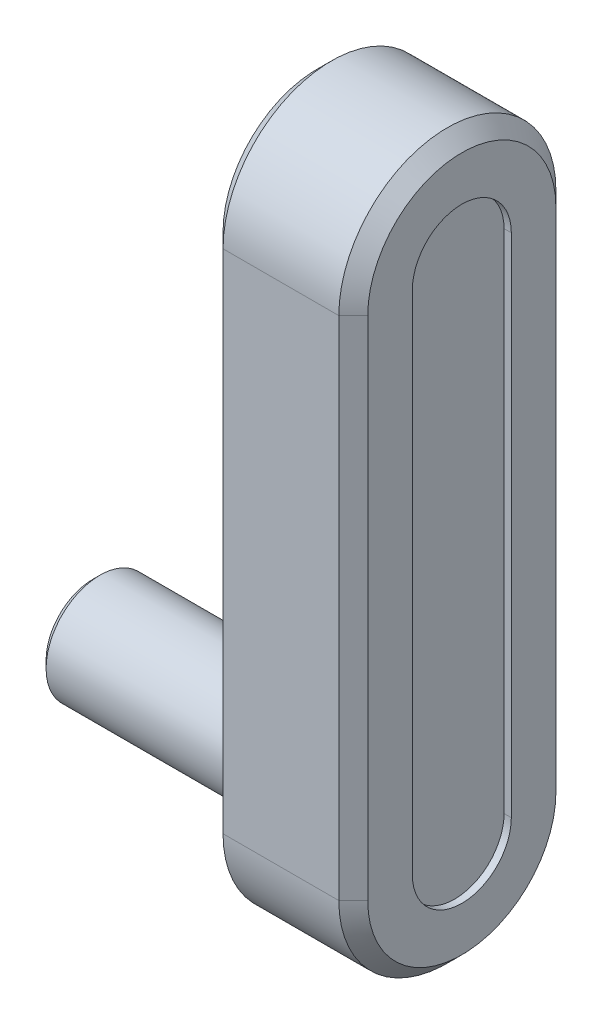
ISO-10303-21;
HEADER;
FILE_DESCRIPTION(('STEP AP214'),'2;1');
FILE_NAME('part.step','',(''),(''),'','','');
FILE_SCHEMA(('AUTOMOTIVE_DESIGN { 1 0 10303 214 1 1 1 1 }'));
ENDSEC;
DATA;
#1=APPLICATION_CONTEXT('core data for automotive mechanical design processes');
#2=APPLICATION_PROTOCOL_DEFINITION('international standard','automotive_design',2000,#1);
#3=PRODUCT_CONTEXT('',#1,'mechanical');
#4=PRODUCT('Part','Part','',(#3));
#5=PRODUCT_RELATED_PRODUCT_CATEGORY('part','',(#4));
#6=PRODUCT_DEFINITION_FORMATION('','',#4);
#7=PRODUCT_DEFINITION_CONTEXT('part definition',#1,'design');
#8=PRODUCT_DEFINITION('design','',#6,#7);
#9=PRODUCT_DEFINITION_SHAPE('','',#8);
#10=(LENGTH_UNIT() NAMED_UNIT(*) SI_UNIT(.MILLI.,.METRE.));
#11=(NAMED_UNIT(*) PLANE_ANGLE_UNIT() SI_UNIT($,.RADIAN.));
#12=(NAMED_UNIT(*) SI_UNIT($,.STERADIAN.) SOLID_ANGLE_UNIT());
#13=UNCERTAINTY_MEASURE_WITH_UNIT(LENGTH_MEASURE(1.E-05),#10,'distance_accuracy_value','');
#14=(GEOMETRIC_REPRESENTATION_CONTEXT(3) GLOBAL_UNCERTAINTY_ASSIGNED_CONTEXT((#13)) GLOBAL_UNIT_ASSIGNED_CONTEXT((#10,
#11,#12)) REPRESENTATION_CONTEXT('',''));
#15=CARTESIAN_POINT('',(0.,0.,0.));
#16=DIRECTION('',(0.,0.,1.));
#17=DIRECTION('',(1.,0.,0.));
#18=AXIS2_PLACEMENT_3D('',#15,#16,#17);
#19=CARTESIAN_POINT('',(30.,0.,15.));
#20=DIRECTION('',(0.,0.,-1.));
#21=DIRECTION('',(0.,1.,0.));
#22=AXIS2_PLACEMENT_3D('',#19,#20,#21);
#23=PLANE('',#22);
#24=DIRECTION('',(-1.,0.,0.));
#25=VECTOR('',#24,1.);
#26=CARTESIAN_POINT('',(30.,0.,15.));
#27=LINE('',#26,#25);
#28=CARTESIAN_POINT('',(28.,0.,15.));
#29=VERTEX_POINT('',#28);
#30=CARTESIAN_POINT('',(12.,0.,15.));
#31=VERTEX_POINT('',#30);
#32=EDGE_CURVE('E189',#29,#31,#27,.T.);
#33=ORIENTED_EDGE('',*,*,#32,.T.);
#34=DIRECTION('',(0.,-1.,0.));
#35=VECTOR('',#34,1.);
#36=CARTESIAN_POINT('',(12.,0.,15.));
#37=LINE('',#36,#35);
#38=CARTESIAN_POINT('',(12.,-70.,15.));
#39=VERTEX_POINT('',#38);
#40=EDGE_CURVE('E242',#31,#39,#37,.T.);
#41=ORIENTED_EDGE('',*,*,#40,.T.);
#42=DIRECTION('',(-1.,0.,0.));
#43=VECTOR('',#42,1.);
#44=CARTESIAN_POINT('',(30.,-70.,15.));
#45=LINE('',#44,#43);
#46=CARTESIAN_POINT('',(28.,-70.,15.));
#47=VERTEX_POINT('',#46);
#48=EDGE_CURVE('E202',#47,#39,#45,.T.);
#49=ORIENTED_EDGE('',*,*,#48,.F.);
#50=DIRECTION('',(0.,1.,0.));
#51=VECTOR('',#50,1.);
#52=CARTESIAN_POINT('',(28.,0.,15.));
#53=LINE('',#52,#51);
#54=EDGE_CURVE('E239',#47,#29,#53,.T.);
#55=ORIENTED_EDGE('',*,*,#54,.T.);
#56=EDGE_LOOP('',(#33,#41,#49,#55));
#57=FACE_BOUND('',#56,.T.);
#58=ADVANCED_FACE('F43',(#57),#23,.F.);
#59=CARTESIAN_POINT('',(30.,-70.,0.));
#60=DIRECTION('',(-1.,0.,0.));
#61=DIRECTION('',(0.,0.,1.));
#62=AXIS2_PLACEMENT_3D('',#59,#60,#61);
#63=CYLINDRICAL_SURFACE('',#62,15.);
#64=ORIENTED_EDGE('',*,*,#48,.T.);
#65=CARTESIAN_POINT('',(12.,-70.,0.));
#66=DIRECTION('',(1.,0.,0.));
#67=DIRECTION('',(0.,0.,-1.));
#68=AXIS2_PLACEMENT_3D('',#65,#66,#67);
#69=CIRCLE('',#68,15.);
#70=CARTESIAN_POINT('',(12.,-70.,-15.));
#71=VERTEX_POINT('',#70);
#72=EDGE_CURVE('E236',#39,#71,#69,.T.);
#73=ORIENTED_EDGE('',*,*,#72,.T.);
#74=DIRECTION('',(-1.,0.,0.));
#75=VECTOR('',#74,1.);
#76=CARTESIAN_POINT('',(30.,-70.,-15.));
#77=LINE('',#76,#75);
#78=CARTESIAN_POINT('',(28.,-70.,-15.));
#79=VERTEX_POINT('',#78);
#80=EDGE_CURVE('E198',#79,#71,#77,.T.);
#81=ORIENTED_EDGE('',*,*,#80,.F.);
#82=CARTESIAN_POINT('',(28.,-70.,0.));
#83=DIRECTION('',(1.,0.,0.));
#84=DIRECTION('',(0.,0.,-1.));
#85=AXIS2_PLACEMENT_3D('',#82,#83,#84);
#86=CIRCLE('',#85,15.);
#87=EDGE_CURVE('E233',#79,#47,#86,.F.);
#88=ORIENTED_EDGE('',*,*,#87,.T.);
#89=EDGE_LOOP('',(#64,#73,#81,#88));
#90=FACE_BOUND('',#89,.T.);
#91=ADVANCED_FACE('F318',(#90),#63,.T.);
#92=CARTESIAN_POINT('',(30.,0.,-15.));
#93=DIRECTION('',(0.,0.,-1.));
#94=DIRECTION('',(0.,1.,0.));
#95=AXIS2_PLACEMENT_3D('',#92,#93,#94);
#96=PLANE('',#95);
#97=ORIENTED_EDGE('',*,*,#80,.T.);
#98=DIRECTION('',(0.,1.,0.));
#99=VECTOR('',#98,1.);
#100=CARTESIAN_POINT('',(12.,0.,-15.));
#101=LINE('',#100,#99);
#102=CARTESIAN_POINT('',(12.,0.,-15.));
#103=VERTEX_POINT('',#102);
#104=EDGE_CURVE('E223',#71,#103,#101,.T.);
#105=ORIENTED_EDGE('',*,*,#104,.T.);
#106=DIRECTION('',(-1.,0.,0.));
#107=VECTOR('',#106,1.);
#108=CARTESIAN_POINT('',(30.,0.,-15.));
#109=LINE('',#108,#107);
#110=CARTESIAN_POINT('',(28.,0.,-15.));
#111=VERTEX_POINT('',#110);
#112=EDGE_CURVE('E193',#111,#103,#109,.T.);
#113=ORIENTED_EDGE('',*,*,#112,.F.);
#114=DIRECTION('',(0.,-1.,0.));
#115=VECTOR('',#114,1.);
#116=CARTESIAN_POINT('',(28.,0.,-15.));
#117=LINE('',#116,#115);
#118=EDGE_CURVE('E219',#111,#79,#117,.T.);
#119=ORIENTED_EDGE('',*,*,#118,.T.);
#120=EDGE_LOOP('',(#97,#105,#113,#119));
#121=FACE_BOUND('',#120,.T.);
#122=ADVANCED_FACE('F324',(#121),#96,.T.);
#123=CARTESIAN_POINT('',(30.,0.,0.));
#124=DIRECTION('',(-1.,0.,0.));
#125=DIRECTION('',(0.,0.,1.));
#126=AXIS2_PLACEMENT_3D('',#123,#124,#125);
#127=CYLINDRICAL_SURFACE('',#126,15.);
#128=ORIENTED_EDGE('',*,*,#112,.T.);
#129=CARTESIAN_POINT('',(12.,0.,0.));
#130=DIRECTION('',(1.,0.,0.));
#131=DIRECTION('',(0.,0.,-1.));
#132=AXIS2_PLACEMENT_3D('',#129,#130,#131);
#133=CIRCLE('',#132,15.);
#134=EDGE_CURVE('E230',#103,#31,#133,.T.);
#135=ORIENTED_EDGE('',*,*,#134,.T.);
#136=ORIENTED_EDGE('',*,*,#32,.F.);
#137=CARTESIAN_POINT('',(28.,0.,0.));
#138=DIRECTION('',(1.,0.,0.));
#139=DIRECTION('',(0.,0.,-1.));
#140=AXIS2_PLACEMENT_3D('',#137,#138,#139);
#141=CIRCLE('',#140,15.);
#142=EDGE_CURVE('E227',#29,#111,#141,.F.);
#143=ORIENTED_EDGE('',*,*,#142,.T.);
#144=EDGE_LOOP('',(#128,#135,#136,#143));
#145=FACE_BOUND('',#144,.T.);
#146=ADVANCED_FACE('F441',(#145),#127,.T.);
#147=CARTESIAN_POINT('',(30.,0.,0.));
#148=DIRECTION('',(1.,0.,0.));
#149=DIRECTION('',(0.,0.,-1.));
#150=AXIS2_PLACEMENT_3D('',#147,#148,#149);
#151=PLANE('',#150);
#152=CARTESIAN_POINT('',(30.,0.,0.));
#153=DIRECTION('',(1.,0.,0.));
#154=DIRECTION('',(0.,0.,-1.));
#155=AXIS2_PLACEMENT_3D('',#152,#153,#154);
#156=CIRCLE('',#155,6.83563427501715);
#157=CARTESIAN_POINT('',(30.,0.,-6.83563427501715));
#158=VERTEX_POINT('',#157);
#159=CARTESIAN_POINT('',(30.,0.,6.83563427501715));
#160=VERTEX_POINT('',#159);
#161=EDGE_CURVE('E60',#158,#160,#156,.T.);
#162=ORIENTED_EDGE('',*,*,#161,.F.);
#163=DIRECTION('',(0.,1.,0.));
#164=VECTOR('',#163,1.);
#165=CARTESIAN_POINT('',(30.,0.,-6.83563427501715));
#166=LINE('',#165,#164);
#167=CARTESIAN_POINT('',(30.,-70.,-6.83563427501715));
#168=VERTEX_POINT('',#167);
#169=EDGE_CURVE('E159',#168,#158,#166,.T.);
#170=ORIENTED_EDGE('',*,*,#169,.F.);
#171=CARTESIAN_POINT('',(30.,-70.,0.));
#172=DIRECTION('',(1.,0.,0.));
#173=DIRECTION('',(0.,0.,-1.));
#174=AXIS2_PLACEMENT_3D('',#171,#172,#173);
#175=CIRCLE('',#174,6.83563427501715);
#176=CARTESIAN_POINT('',(30.,-70.,6.83563427501714));
#177=VERTEX_POINT('',#176);
#178=EDGE_CURVE('E163',#177,#168,#175,.T.);
#179=ORIENTED_EDGE('',*,*,#178,.F.);
#180=DIRECTION('',(0.,-1.,0.));
#181=VECTOR('',#180,1.);
#182=CARTESIAN_POINT('',(30.,0.,6.83563427501715));
#183=LINE('',#182,#181);
#184=EDGE_CURVE('E174',#160,#177,#183,.T.);
#185=ORIENTED_EDGE('',*,*,#184,.F.);
#186=EDGE_LOOP('',(#162,#170,#179,#185));
#187=FACE_BOUND('',#186,.T.);
#188=CARTESIAN_POINT('',(30.,-70.,0.));
#189=DIRECTION('',(1.,0.,0.));
#190=DIRECTION('',(0.,0.,-1.));
#191=AXIS2_PLACEMENT_3D('',#188,#189,#190);
#192=CIRCLE('',#191,13.);
#193=CARTESIAN_POINT('',(30.,-70.,13.));
#194=VERTEX_POINT('',#193);
#195=CARTESIAN_POINT('',(30.,-70.,-13.));
#196=VERTEX_POINT('',#195);
#197=EDGE_CURVE('E248',#194,#196,#192,.T.);
#198=ORIENTED_EDGE('',*,*,#197,.T.);
#199=DIRECTION('',(0.,1.,0.));
#200=VECTOR('',#199,1.);
#201=CARTESIAN_POINT('',(30.,0.,-13.));
#202=LINE('',#201,#200);
#203=CARTESIAN_POINT('',(30.,0.,-13.));
#204=VERTEX_POINT('',#203);
#205=EDGE_CURVE('E254',#196,#204,#202,.T.);
#206=ORIENTED_EDGE('',*,*,#205,.T.);
#207=CARTESIAN_POINT('',(30.,0.,0.));
#208=DIRECTION('',(1.,0.,0.));
#209=DIRECTION('',(0.,0.,-1.));
#210=AXIS2_PLACEMENT_3D('',#207,#208,#209);
#211=CIRCLE('',#210,13.);
#212=CARTESIAN_POINT('',(30.,0.,13.));
#213=VERTEX_POINT('',#212);
#214=EDGE_CURVE('E251',#204,#213,#211,.T.);
#215=ORIENTED_EDGE('',*,*,#214,.T.);
#216=DIRECTION('',(0.,-1.,0.));
#217=VECTOR('',#216,1.);
#218=CARTESIAN_POINT('',(30.,-70.,13.));
#219=LINE('',#218,#217);
#220=EDGE_CURVE('E245',#213,#194,#219,.T.);
#221=ORIENTED_EDGE('',*,*,#220,.T.);
#222=EDGE_LOOP('',(#198,#206,#215,#221));
#223=FACE_BOUND('',#222,.T.);
#224=ADVANCED_FACE('F438',(#187,#223),#151,.T.);
#225=CARTESIAN_POINT('',(10.,0.,0.));
#226=DIRECTION('',(1.,0.,0.));
#227=DIRECTION('',(0.,0.,-1.));
#228=AXIS2_PLACEMENT_3D('',#225,#226,#227);
#229=PLANE('',#228);
#230=CARTESIAN_POINT('',(10.,0.,0.));
#231=DIRECTION('',(1.,0.,0.));
#232=DIRECTION('',(0.,0.,-1.));
#233=AXIS2_PLACEMENT_3D('',#230,#231,#232);
#234=CIRCLE('',#233,5.89999999999997);
#235=CARTESIAN_POINT('',(10.,0.,-5.89999999999997));
#236=VERTEX_POINT('',#235);
#237=EDGE_CURVE('E295',#236,#236,#234,.T.);
#238=ORIENTED_EDGE('',*,*,#237,.T.);
#239=EDGE_LOOP('',(#238));
#240=FACE_BOUND('',#239,.T.);
#241=CARTESIAN_POINT('',(10.,-70.,0.));
#242=DIRECTION('',(1.,0.,0.));
#243=DIRECTION('',(0.,0.,-1.));
#244=AXIS2_PLACEMENT_3D('',#241,#242,#243);
#245=CIRCLE('',#244,10.);
#246=CARTESIAN_POINT('',(10.,-70.,-10.));
#247=VERTEX_POINT('',#246);
#248=EDGE_CURVE('E258',#247,#247,#245,.F.);
#249=ORIENTED_EDGE('',*,*,#248,.F.);
#250=EDGE_LOOP('',(#249));
#251=FACE_BOUND('',#250,.T.);
#252=CARTESIAN_POINT('',(10.,0.,0.));
#253=DIRECTION('',(1.,0.,0.));
#254=DIRECTION('',(0.,0.,-1.));
#255=AXIS2_PLACEMENT_3D('',#252,#253,#254);
#256=CIRCLE('',#255,13.);
#257=CARTESIAN_POINT('',(10.,0.,13.));
#258=VERTEX_POINT('',#257);
#259=CARTESIAN_POINT('',(10.,0.,-13.));
#260=VERTEX_POINT('',#259);
#261=EDGE_CURVE('E212',#258,#260,#256,.F.);
#262=ORIENTED_EDGE('',*,*,#261,.T.);
#263=DIRECTION('',(0.,-1.,0.));
#264=VECTOR('',#263,1.);
#265=CARTESIAN_POINT('',(10.,-70.,-13.));
#266=LINE('',#265,#264);
#267=CARTESIAN_POINT('',(10.,-70.,-13.));
#268=VERTEX_POINT('',#267);
#269=EDGE_CURVE('E215',#260,#268,#266,.T.);
#270=ORIENTED_EDGE('',*,*,#269,.T.);
#271=CARTESIAN_POINT('',(10.,-70.,0.));
#272=DIRECTION('',(1.,0.,0.));
#273=DIRECTION('',(0.,0.,-1.));
#274=AXIS2_PLACEMENT_3D('',#271,#272,#273);
#275=CIRCLE('',#274,13.);
#276=CARTESIAN_POINT('',(10.,-70.,13.));
#277=VERTEX_POINT('',#276);
#278=EDGE_CURVE('E209',#268,#277,#275,.F.);
#279=ORIENTED_EDGE('',*,*,#278,.T.);
#280=DIRECTION('',(0.,1.,0.));
#281=VECTOR('',#280,1.);
#282=CARTESIAN_POINT('',(10.,0.,13.));
#283=LINE('',#282,#281);
#284=EDGE_CURVE('E206',#277,#258,#283,.T.);
#285=ORIENTED_EDGE('',*,*,#284,.T.);
#286=EDGE_LOOP('',(#262,#270,#279,#285));
#287=FACE_BOUND('',#286,.T.);
#288=ADVANCED_FACE('F358',(#240,#251,#287),#229,.F.);
#289=CARTESIAN_POINT('',(12.,0.,15.));
#290=DIRECTION('',(0.70710678118655,0.,-0.707106781186545));
#291=DIRECTION('',(0.,-1.,0.));
#292=AXIS2_PLACEMENT_3D('',#289,#290,#291);
#293=PLANE('',#292);
#294=DIRECTION('',(-0.707106781186545,0.,-0.70710678118655));
#295=VECTOR('',#294,1.);
#296=CARTESIAN_POINT('',(12.,-70.,15.));
#297=LINE('',#296,#295);
#298=EDGE_CURVE('E266',#39,#277,#297,.T.);
#299=ORIENTED_EDGE('',*,*,#298,.F.);
#300=ORIENTED_EDGE('',*,*,#40,.F.);
#301=DIRECTION('',(0.707106781186545,0.,0.70710678118655));
#302=VECTOR('',#301,1.);
#303=CARTESIAN_POINT('',(10.,0.,13.));
#304=LINE('',#303,#302);
#305=EDGE_CURVE('E194',#258,#31,#304,.T.);
#306=ORIENTED_EDGE('',*,*,#305,.F.);
#307=ORIENTED_EDGE('',*,*,#284,.F.);
#308=EDGE_LOOP('',(#299,#300,#306,#307));
#309=FACE_BOUND('',#308,.T.);
#310=ADVANCED_FACE('F352',(#309),#293,.F.);
#311=CARTESIAN_POINT('',(12.,0.,0.));
#312=DIRECTION('',(1.,0.,0.));
#313=DIRECTION('',(0.,0.,-1.));
#314=AXIS2_PLACEMENT_3D('',#311,#312,#313);
#315=CONICAL_SURFACE('',#314,15.,0.785398163397452);
#316=ORIENTED_EDGE('',*,*,#305,.T.);
#317=ORIENTED_EDGE('',*,*,#134,.F.);
#318=DIRECTION('',(0.707106781186545,0.,-0.70710678118655));
#319=VECTOR('',#318,1.);
#320=CARTESIAN_POINT('',(10.,0.,-13.));
#321=LINE('',#320,#319);
#322=EDGE_CURVE('E262',#260,#103,#321,.T.);
#323=ORIENTED_EDGE('',*,*,#322,.F.);
#324=ORIENTED_EDGE('',*,*,#261,.F.);
#325=EDGE_LOOP('',(#316,#317,#323,#324));
#326=FACE_BOUND('',#325,.T.);
#327=ADVANCED_FACE('F345',(#326),#315,.T.);
#328=CARTESIAN_POINT('',(12.,-70.,0.));
#329=DIRECTION('',(1.,0.,0.));
#330=DIRECTION('',(0.,0.,-1.));
#331=AXIS2_PLACEMENT_3D('',#328,#329,#330);
#332=CONICAL_SURFACE('',#331,15.,0.785398163397452);
#333=ORIENTED_EDGE('',*,*,#298,.T.);
#334=ORIENTED_EDGE('',*,*,#278,.F.);
#335=DIRECTION('',(-0.707106781186545,0.,0.70710678118655));
#336=VECTOR('',#335,1.);
#337=CARTESIAN_POINT('',(12.,-70.,-15.));
#338=LINE('',#337,#336);
#339=EDGE_CURVE('E259',#71,#268,#338,.T.);
#340=ORIENTED_EDGE('',*,*,#339,.F.);
#341=ORIENTED_EDGE('',*,*,#72,.F.);
#342=EDGE_LOOP('',(#333,#334,#340,#341));
#343=FACE_BOUND('',#342,.T.);
#344=ADVANCED_FACE('F338',(#343),#332,.T.);
#345=CARTESIAN_POINT('',(10.,0.,-13.));
#346=DIRECTION('',(-0.70710678118655,0.,-0.707106781186545));
#347=DIRECTION('',(0.,1.,0.));
#348=AXIS2_PLACEMENT_3D('',#345,#346,#347);
#349=PLANE('',#348);
#350=ORIENTED_EDGE('',*,*,#322,.T.);
#351=ORIENTED_EDGE('',*,*,#104,.F.);
#352=ORIENTED_EDGE('',*,*,#339,.T.);
#353=ORIENTED_EDGE('',*,*,#269,.F.);
#354=EDGE_LOOP('',(#350,#351,#352,#353));
#355=FACE_BOUND('',#354,.T.);
#356=ADVANCED_FACE('F330',(#355),#349,.T.);
#357=CARTESIAN_POINT('',(30.,0.,13.));
#358=DIRECTION('',(0.707106781186545,0.,0.70710678118655));
#359=DIRECTION('',(0.,1.,0.));
#360=AXIS2_PLACEMENT_3D('',#357,#358,#359);
#361=PLANE('',#360);
#362=DIRECTION('',(-0.70710678118655,0.,0.707106781186545));
#363=VECTOR('',#362,1.);
#364=CARTESIAN_POINT('',(30.,-70.,13.));
#365=LINE('',#364,#363);
#366=EDGE_CURVE('E277',#194,#47,#365,.T.);
#367=ORIENTED_EDGE('',*,*,#366,.F.);
#368=ORIENTED_EDGE('',*,*,#220,.F.);
#369=DIRECTION('',(0.70710678118655,0.,-0.707106781186545));
#370=VECTOR('',#369,1.);
#371=CARTESIAN_POINT('',(28.,0.,15.));
#372=LINE('',#371,#370);
#373=EDGE_CURVE('E263',#29,#213,#372,.T.);
#374=ORIENTED_EDGE('',*,*,#373,.F.);
#375=ORIENTED_EDGE('',*,*,#54,.F.);
#376=EDGE_LOOP('',(#367,#368,#374,#375));
#377=FACE_BOUND('',#376,.T.);
#378=ADVANCED_FACE('F337',(#377),#361,.T.);
#379=CARTESIAN_POINT('',(30.,0.,0.));
#380=DIRECTION('',(-1.,0.,0.));
#381=DIRECTION('',(0.,0.,1.));
#382=AXIS2_PLACEMENT_3D('',#379,#380,#381);
#383=CONICAL_SURFACE('',#382,13.,0.785398163397445);
#384=ORIENTED_EDGE('',*,*,#373,.T.);
#385=ORIENTED_EDGE('',*,*,#214,.F.);
#386=DIRECTION('',(0.70710678118655,0.,0.707106781186545));
#387=VECTOR('',#386,1.);
#388=CARTESIAN_POINT('',(28.,0.,-15.));
#389=LINE('',#388,#387);
#390=EDGE_CURVE('E68',#111,#204,#389,.T.);
#391=ORIENTED_EDGE('',*,*,#390,.F.);
#392=ORIENTED_EDGE('',*,*,#142,.F.);
#393=EDGE_LOOP('',(#384,#385,#391,#392));
#394=FACE_BOUND('',#393,.T.);
#395=ADVANCED_FACE('F374',(#394),#383,.T.);
#396=CARTESIAN_POINT('',(30.,-70.,0.));
#397=DIRECTION('',(-1.,0.,0.));
#398=DIRECTION('',(0.,0.,1.));
#399=AXIS2_PLACEMENT_3D('',#396,#397,#398);
#400=CONICAL_SURFACE('',#399,13.,0.785398163397445);
#401=ORIENTED_EDGE('',*,*,#366,.T.);
#402=ORIENTED_EDGE('',*,*,#87,.F.);
#403=DIRECTION('',(-0.70710678118655,0.,-0.707106781186545));
#404=VECTOR('',#403,1.);
#405=CARTESIAN_POINT('',(30.,-70.,-13.));
#406=LINE('',#405,#404);
#407=EDGE_CURVE('E183',#196,#79,#406,.T.);
#408=ORIENTED_EDGE('',*,*,#407,.F.);
#409=ORIENTED_EDGE('',*,*,#197,.F.);
#410=EDGE_LOOP('',(#401,#402,#408,#409));
#411=FACE_BOUND('',#410,.T.);
#412=ADVANCED_FACE('F368',(#411),#400,.T.);
#413=CARTESIAN_POINT('',(28.,0.,-15.));
#414=DIRECTION('',(-0.707106781186545,0.,0.70710678118655));
#415=DIRECTION('',(0.,-1.,0.));
#416=AXIS2_PLACEMENT_3D('',#413,#414,#415);
#417=PLANE('',#416);
#418=ORIENTED_EDGE('',*,*,#390,.T.);
#419=ORIENTED_EDGE('',*,*,#205,.F.);
#420=ORIENTED_EDGE('',*,*,#407,.T.);
#421=ORIENTED_EDGE('',*,*,#118,.F.);
#422=EDGE_LOOP('',(#418,#419,#420,#421));
#423=FACE_BOUND('',#422,.T.);
#424=ADVANCED_FACE('F361',(#423),#417,.F.);
#425=CARTESIAN_POINT('',(29.,0.,0.));
#426=DIRECTION('',(1.,0.,0.));
#427=DIRECTION('',(0.,0.,-1.));
#428=AXIS2_PLACEMENT_3D('',#425,#426,#427);
#429=CYLINDRICAL_SURFACE('',#428,6.83563427501715);
#430=ORIENTED_EDGE('',*,*,#161,.T.);
#431=DIRECTION('',(1.,0.,0.));
#432=VECTOR('',#431,1.);
#433=CARTESIAN_POINT('',(29.,0.,6.83563427501715));
#434=LINE('',#433,#432);
#435=CARTESIAN_POINT('',(29.,0.,6.83563427501715));
#436=VERTEX_POINT('',#435);
#437=EDGE_CURVE('E134',#436,#160,#434,.T.);
#438=ORIENTED_EDGE('',*,*,#437,.F.);
#439=CARTESIAN_POINT('',(29.,0.,0.));
#440=DIRECTION('',(1.,0.,0.));
#441=DIRECTION('',(0.,0.,-1.));
#442=AXIS2_PLACEMENT_3D('',#439,#440,#441);
#443=CIRCLE('',#442,6.83563427501715);
#444=CARTESIAN_POINT('',(29.,0.,-6.83563427501715));
#445=VERTEX_POINT('',#444);
#446=EDGE_CURVE('E138',#445,#436,#443,.T.);
#447=ORIENTED_EDGE('',*,*,#446,.F.);
#448=DIRECTION('',(1.,0.,0.));
#449=VECTOR('',#448,1.);
#450=CARTESIAN_POINT('',(29.,0.,-6.83563427501715));
#451=LINE('',#450,#449);
#452=EDGE_CURVE('E180',#445,#158,#451,.T.);
#453=ORIENTED_EDGE('',*,*,#452,.T.);
#454=EDGE_LOOP('',(#430,#438,#447,#453));
#455=FACE_BOUND('',#454,.T.);
#456=ADVANCED_FACE('F136',(#455),#429,.F.);
#457=CARTESIAN_POINT('',(29.,0.,-6.83563427501715));
#458=DIRECTION('',(0.,0.,-1.));
#459=DIRECTION('',(0.,1.,0.));
#460=AXIS2_PLACEMENT_3D('',#457,#458,#459);
#461=PLANE('',#460);
#462=ORIENTED_EDGE('',*,*,#169,.T.);
#463=ORIENTED_EDGE('',*,*,#452,.F.);
#464=DIRECTION('',(0.,1.,0.));
#465=VECTOR('',#464,1.);
#466=CARTESIAN_POINT('',(29.,0.,-6.83563427501715));
#467=LINE('',#466,#465);
#468=CARTESIAN_POINT('',(29.,-70.,-6.83563427501715));
#469=VERTEX_POINT('',#468);
#470=EDGE_CURVE('E145',#469,#445,#467,.T.);
#471=ORIENTED_EDGE('',*,*,#470,.F.);
#472=DIRECTION('',(1.,0.,0.));
#473=VECTOR('',#472,1.);
#474=CARTESIAN_POINT('',(29.,-70.,-6.83563427501715));
#475=LINE('',#474,#473);
#476=EDGE_CURVE('E184',#469,#168,#475,.T.);
#477=ORIENTED_EDGE('',*,*,#476,.T.);
#478=EDGE_LOOP('',(#462,#463,#471,#477));
#479=FACE_BOUND('',#478,.T.);
#480=ADVANCED_FACE('F426',(#479),#461,.F.);
#481=CARTESIAN_POINT('',(29.,-70.,0.));
#482=DIRECTION('',(1.,0.,0.));
#483=DIRECTION('',(0.,0.,-1.));
#484=AXIS2_PLACEMENT_3D('',#481,#482,#483);
#485=CYLINDRICAL_SURFACE('',#484,6.83563427501715);
#486=ORIENTED_EDGE('',*,*,#178,.T.);
#487=ORIENTED_EDGE('',*,*,#476,.F.);
#488=CARTESIAN_POINT('',(29.,-70.,0.));
#489=DIRECTION('',(1.,0.,0.));
#490=DIRECTION('',(0.,0.,-1.));
#491=AXIS2_PLACEMENT_3D('',#488,#489,#490);
#492=CIRCLE('',#491,6.83563427501715);
#493=CARTESIAN_POINT('',(29.,-70.,6.83563427501714));
#494=VERTEX_POINT('',#493);
#495=EDGE_CURVE('E154',#494,#469,#492,.T.);
#496=ORIENTED_EDGE('',*,*,#495,.F.);
#497=DIRECTION('',(1.,0.,0.));
#498=VECTOR('',#497,1.);
#499=CARTESIAN_POINT('',(29.,-70.,6.83563427501714));
#500=LINE('',#499,#498);
#501=EDGE_CURVE('E144',#494,#177,#500,.T.);
#502=ORIENTED_EDGE('',*,*,#501,.T.);
#503=EDGE_LOOP('',(#486,#487,#496,#502));
#504=FACE_BOUND('',#503,.T.);
#505=ADVANCED_FACE('F429',(#504),#485,.F.);
#506=CARTESIAN_POINT('',(29.,0.,6.83563427501715));
#507=DIRECTION('',(0.,0.,1.));
#508=DIRECTION('',(0.,-1.,0.));
#509=AXIS2_PLACEMENT_3D('',#506,#507,#508);
#510=PLANE('',#509);
#511=ORIENTED_EDGE('',*,*,#184,.T.);
#512=ORIENTED_EDGE('',*,*,#501,.F.);
#513=DIRECTION('',(0.,-1.,0.));
#514=VECTOR('',#513,1.);
#515=CARTESIAN_POINT('',(29.,0.,6.83563427501715));
#516=LINE('',#515,#514);
#517=EDGE_CURVE('E148',#436,#494,#516,.T.);
#518=ORIENTED_EDGE('',*,*,#517,.F.);
#519=ORIENTED_EDGE('',*,*,#437,.T.);
#520=EDGE_LOOP('',(#511,#512,#518,#519));
#521=FACE_BOUND('',#520,.T.);
#522=ADVANCED_FACE('F149',(#521),#510,.F.);
#523=CARTESIAN_POINT('',(29.,0.,0.));
#524=DIRECTION('',(1.,0.,0.));
#525=DIRECTION('',(0.,0.,-1.));
#526=AXIS2_PLACEMENT_3D('',#523,#524,#525);
#527=PLANE('',#526);
#528=ORIENTED_EDGE('',*,*,#446,.T.);
#529=ORIENTED_EDGE('',*,*,#517,.T.);
#530=ORIENTED_EDGE('',*,*,#495,.T.);
#531=ORIENTED_EDGE('',*,*,#470,.T.);
#532=EDGE_LOOP('',(#528,#529,#530,#531));
#533=FACE_BOUND('',#532,.T.);
#534=ADVANCED_FACE('F156',(#533),#527,.T.);
#535=CARTESIAN_POINT('',(25.,0.,0.));
#536=DIRECTION('',(-1.,0.,0.));
#537=DIRECTION('',(0.,0.,1.));
#538=AXIS2_PLACEMENT_3D('',#535,#536,#537);
#539=CYLINDRICAL_SURFACE('',#538,4.9);
#540=CARTESIAN_POINT('',(11.,0.,0.));
#541=DIRECTION('',(1.,0.,0.));
#542=DIRECTION('',(0.,0.,-1.));
#543=AXIS2_PLACEMENT_3D('',#540,#541,#542);
#544=CIRCLE('',#543,4.9);
#545=CARTESIAN_POINT('',(11.,0.,-4.9));
#546=VERTEX_POINT('',#545);
#547=EDGE_CURVE('E299',#546,#546,#544,.F.);
#548=ORIENTED_EDGE('',*,*,#547,.T.);
#549=EDGE_LOOP('',(#548));
#550=FACE_BOUND('',#549,.T.);
#551=CARTESIAN_POINT('',(25.,0.,0.));
#552=DIRECTION('',(-1.,0.,0.));
#553=DIRECTION('',(0.,0.,1.));
#554=AXIS2_PLACEMENT_3D('',#551,#552,#553);
#555=CIRCLE('',#554,4.9);
#556=CARTESIAN_POINT('',(25.,0.,4.9));
#557=VERTEX_POINT('',#556);
#558=EDGE_CURVE('E166',#557,#557,#555,.T.);
#559=ORIENTED_EDGE('',*,*,#558,.F.);
#560=EDGE_LOOP('',(#559));
#561=FACE_BOUND('',#560,.T.);
#562=ADVANCED_FACE('F417',(#550,#561),#539,.F.);
#563=CARTESIAN_POINT('',(25.,0.,0.));
#564=DIRECTION('',(-1.,0.,0.));
#565=DIRECTION('',(0.,0.,1.));
#566=AXIS2_PLACEMENT_3D('',#563,#564,#565);
#567=PLANE('',#566);
#568=ORIENTED_EDGE('',*,*,#558,.T.);
#569=EDGE_LOOP('',(#568));
#570=FACE_BOUND('',#569,.T.);
#571=ADVANCED_FACE('F408',(#570),#567,.T.);
#572=CARTESIAN_POINT('',(9.,-70.,0.));
#573=DIRECTION('',(-1.,0.,0.));
#574=DIRECTION('',(0.,0.,1.));
#575=AXIS2_PLACEMENT_3D('',#572,#573,#574);
#576=PLANE('',#575);
#577=CARTESIAN_POINT('',(9.,-70.,0.));
#578=DIRECTION('',(-1.,0.,0.));
#579=DIRECTION('',(0.,0.,1.));
#580=AXIS2_PLACEMENT_3D('',#577,#578,#579);
#581=CIRCLE('',#580,9.00000000000002);
#582=CARTESIAN_POINT('',(9.,-70.,9.00000000000001));
#583=VERTEX_POINT('',#582);
#584=EDGE_CURVE('E291',#583,#583,#581,.T.);
#585=ORIENTED_EDGE('',*,*,#584,.T.);
#586=EDGE_LOOP('',(#585));
#587=FACE_BOUND('',#586,.T.);
#588=CARTESIAN_POINT('',(9.,-70.,0.));
#589=DIRECTION('',(-1.,0.,0.));
#590=DIRECTION('',(0.,0.,1.));
#591=AXIS2_PLACEMENT_3D('',#588,#589,#590);
#592=CIRCLE('',#591,7.45);
#593=CARTESIAN_POINT('',(9.,-70.,7.44999999999999));
#594=VERTEX_POINT('',#593);
#595=EDGE_CURVE('E284',#594,#594,#592,.T.);
#596=ORIENTED_EDGE('',*,*,#595,.F.);
#597=EDGE_LOOP('',(#596));
#598=FACE_BOUND('',#597,.T.);
#599=ADVANCED_FACE('F405',(#587,#598),#576,.T.);
#600=CARTESIAN_POINT('',(-21.,-70.,0.));
#601=DIRECTION('',(-1.,0.,0.));
#602=DIRECTION('',(0.,0.,1.));
#603=AXIS2_PLACEMENT_3D('',#600,#601,#602);
#604=PLANE('',#603);
#605=CARTESIAN_POINT('',(-21.,-70.,0.));
#606=DIRECTION('',(-1.,0.,0.));
#607=DIRECTION('',(0.,0.,1.));
#608=AXIS2_PLACEMENT_3D('',#605,#606,#607);
#609=CIRCLE('',#608,6.45000000000001);
#610=CARTESIAN_POINT('',(-21.,-70.,6.45));
#611=VERTEX_POINT('',#610);
#612=EDGE_CURVE('E53',#611,#611,#609,.T.);
#613=ORIENTED_EDGE('',*,*,#612,.T.);
#614=EDGE_LOOP('',(#613));
#615=FACE_BOUND('',#614,.T.);
#616=ADVANCED_FACE('F306',(#615),#604,.T.);
#617=CARTESIAN_POINT('',(-21.,-70.,0.));
#618=DIRECTION('',(1.,0.,0.));
#619=DIRECTION('',(0.,0.,-1.));
#620=AXIS2_PLACEMENT_3D('',#617,#618,#619);
#621=CYLINDRICAL_SURFACE('',#620,7.45);
#622=CARTESIAN_POINT('',(-20.,-70.,0.));
#623=DIRECTION('',(-1.,0.,0.));
#624=DIRECTION('',(0.,0.,1.));
#625=AXIS2_PLACEMENT_3D('',#622,#623,#624);
#626=CIRCLE('',#625,7.45);
#627=CARTESIAN_POINT('',(-20.,-70.,7.44999999999999));
#628=VERTEX_POINT('',#627);
#629=EDGE_CURVE('E11',#628,#628,#626,.F.);
#630=ORIENTED_EDGE('',*,*,#629,.T.);
#631=EDGE_LOOP('',(#630));
#632=FACE_BOUND('',#631,.T.);
#633=ORIENTED_EDGE('',*,*,#595,.T.);
#634=EDGE_LOOP('',(#633));
#635=FACE_BOUND('',#634,.T.);
#636=ADVANCED_FACE('F390',(#632,#635),#621,.T.);
#637=CARTESIAN_POINT('',(9.,-70.,0.));
#638=DIRECTION('',(1.,0.,0.));
#639=DIRECTION('',(0.,0.,-1.));
#640=AXIS2_PLACEMENT_3D('',#637,#638,#639);
#641=CONICAL_SURFACE('',#640,9.00000000000002,0.785398163397452);
#642=ORIENTED_EDGE('',*,*,#248,.T.);
#643=EDGE_LOOP('',(#642));
#644=FACE_BOUND('',#643,.T.);
#645=ORIENTED_EDGE('',*,*,#584,.F.);
#646=EDGE_LOOP('',(#645));
#647=FACE_BOUND('',#646,.T.);
#648=ADVANCED_FACE('F314',(#644,#647),#641,.T.);
#649=CARTESIAN_POINT('',(10.,0.,0.));
#650=DIRECTION('',(-1.,0.,0.));
#651=DIRECTION('',(0.,0.,1.));
#652=AXIS2_PLACEMENT_3D('',#649,#650,#651);
#653=CONICAL_SURFACE('',#652,5.89999999999997,0.785398163397443);
#654=ORIENTED_EDGE('',*,*,#547,.F.);
#655=EDGE_LOOP('',(#654));
#656=FACE_BOUND('',#655,.T.);
#657=ORIENTED_EDGE('',*,*,#237,.F.);
#658=EDGE_LOOP('',(#657));
#659=FACE_BOUND('',#658,.T.);
#660=ADVANCED_FACE('F309',(#656,#659),#653,.F.);
#661=CARTESIAN_POINT('',(-21.,-70.,0.));
#662=DIRECTION('',(1.,0.,0.));
#663=DIRECTION('',(0.,0.,-1.));
#664=AXIS2_PLACEMENT_3D('',#661,#662,#663);
#665=CONICAL_SURFACE('',#664,6.45000000000001,0.785398163397441);
#666=ORIENTED_EDGE('',*,*,#629,.F.);
#667=EDGE_LOOP('',(#666));
#668=FACE_BOUND('',#667,.T.);
#669=ORIENTED_EDGE('',*,*,#612,.F.);
#670=EDGE_LOOP('',(#669));
#671=FACE_BOUND('',#670,.T.);
#672=ADVANCED_FACE('F46',(#668,#671),#665,.T.);
#673=CLOSED_SHELL('',(#58,#91,#122,#146,#224,#288,#310,#327,#344,#356,#378,#395,#412,#424,#456,
#480,#505,#522,#534,#562,#571,#599,#616,#636,#648,#660,#672));
#674=MANIFOLD_SOLID_BREP('B2',#673);
#675=ADVANCED_BREP_SHAPE_REPRESENTATION('',(#18,#674),#14);
#676=SHAPE_DEFINITION_REPRESENTATION(#9,#675);
ENDSEC;
END-ISO-10303-21;
